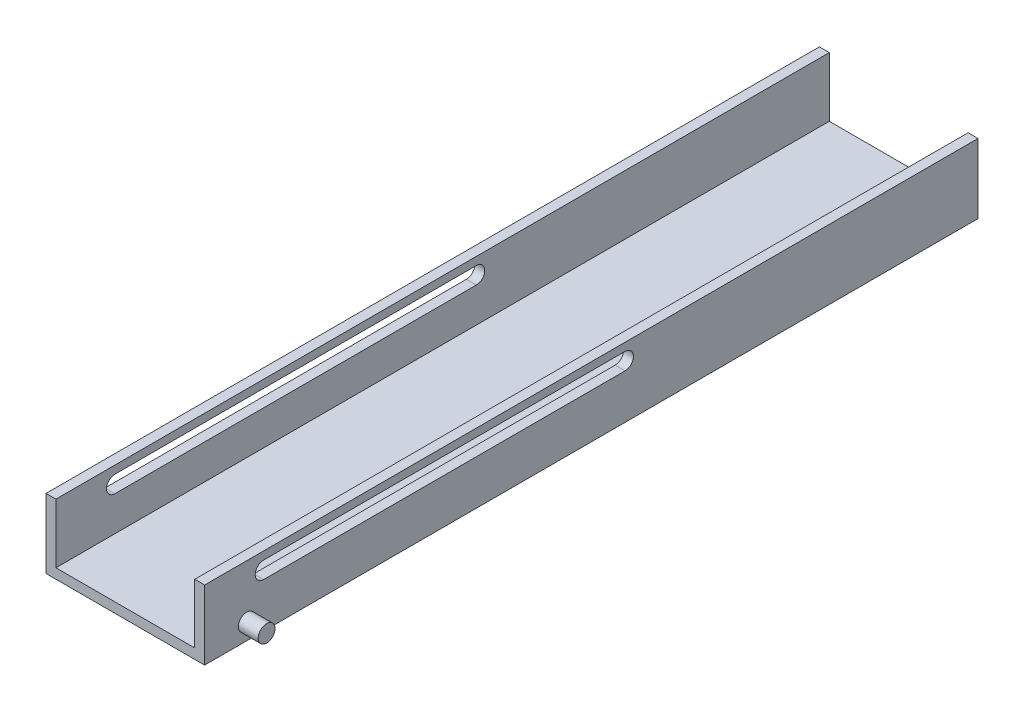
ISO-10303-21;
HEADER;
FILE_DESCRIPTION(('STEP AP214'),'2;1');
FILE_NAME('part.step','',(''),(''),'','','');
FILE_SCHEMA(('AUTOMOTIVE_DESIGN { 1 0 10303 214 1 1 1 1 }'));
ENDSEC;
DATA;
#1=APPLICATION_CONTEXT('core data for automotive mechanical design processes');
#2=APPLICATION_PROTOCOL_DEFINITION('international standard','automotive_design',2000,#1);
#3=PRODUCT_CONTEXT('',#1,'mechanical');
#4=PRODUCT('Part','Part','',(#3));
#5=PRODUCT_RELATED_PRODUCT_CATEGORY('part','',(#4));
#6=PRODUCT_DEFINITION_FORMATION('','',#4);
#7=PRODUCT_DEFINITION_CONTEXT('part definition',#1,'design');
#8=PRODUCT_DEFINITION('design','',#6,#7);
#9=PRODUCT_DEFINITION_SHAPE('','',#8);
#10=(LENGTH_UNIT() NAMED_UNIT(*) SI_UNIT(.MILLI.,.METRE.));
#11=(NAMED_UNIT(*) PLANE_ANGLE_UNIT() SI_UNIT($,.RADIAN.));
#12=(NAMED_UNIT(*) SI_UNIT($,.STERADIAN.) SOLID_ANGLE_UNIT());
#13=UNCERTAINTY_MEASURE_WITH_UNIT(LENGTH_MEASURE(1.E-05),#10,'distance_accuracy_value','');
#14=(GEOMETRIC_REPRESENTATION_CONTEXT(3) GLOBAL_UNCERTAINTY_ASSIGNED_CONTEXT((#13)) GLOBAL_UNIT_ASSIGNED_CONTEXT((#10,
#11,#12)) REPRESENTATION_CONTEXT('',''));
#15=CARTESIAN_POINT('',(0.,0.,0.));
#16=DIRECTION('',(0.,0.,1.));
#17=DIRECTION('',(1.,0.,0.));
#18=AXIS2_PLACEMENT_3D('',#15,#16,#17);
#19=CARTESIAN_POINT('',(20.,13.375,91.5));
#20=DIRECTION('',(-1.,0.,0.));
#21=DIRECTION('',(0.,0.,1.));
#22=AXIS2_PLACEMENT_3D('',#19,#20,#21);
#23=CYLINDRICAL_SURFACE('',#22,2.12499999999999);
#24=CARTESIAN_POINT('',(-17.5,13.375,91.5));
#25=DIRECTION('',(-1.,0.,0.));
#26=DIRECTION('',(0.,0.,1.));
#27=AXIS2_PLACEMENT_3D('',#24,#25,#26);
#28=CIRCLE('',#27,2.12499999999999);
#29=CARTESIAN_POINT('',(-17.5,11.25,91.5));
#30=VERTEX_POINT('',#29);
#31=CARTESIAN_POINT('',(-17.5,15.5,91.5));
#32=VERTEX_POINT('',#31);
#33=EDGE_CURVE('E11',#30,#32,#28,.T.);
#34=ORIENTED_EDGE('',*,*,#33,.F.);
#35=DIRECTION('',(-1.,0.,0.));
#36=VECTOR('',#35,1.);
#37=CARTESIAN_POINT('',(20.,11.25,91.5));
#38=LINE('',#37,#36);
#39=CARTESIAN_POINT('',(-20.,11.25,91.5));
#40=VERTEX_POINT('',#39);
#41=EDGE_CURVE('E221',#30,#40,#38,.T.);
#42=ORIENTED_EDGE('',*,*,#41,.T.);
#43=CARTESIAN_POINT('',(-20.,13.375,91.5));
#44=DIRECTION('',(1.,0.,0.));
#45=DIRECTION('',(0.,0.,1.));
#46=AXIS2_PLACEMENT_3D('',#43,#44,#45);
#47=CIRCLE('',#46,2.12499999999999);
#48=CARTESIAN_POINT('',(-20.,15.5,91.5));
#49=VERTEX_POINT('',#48);
#50=EDGE_CURVE('E211',#49,#40,#47,.T.);
#51=ORIENTED_EDGE('',*,*,#50,.F.);
#52=DIRECTION('',(-1.,0.,0.));
#53=VECTOR('',#52,1.);
#54=CARTESIAN_POINT('',(20.,15.5,91.5));
#55=LINE('',#54,#53);
#56=EDGE_CURVE('E214',#32,#49,#55,.T.);
#57=ORIENTED_EDGE('',*,*,#56,.F.);
#58=EDGE_LOOP('',(#34,#42,#51,#57));
#59=FACE_BOUND('',#58,.T.);
#60=ADVANCED_FACE('F39',(#59),#23,.F.);
#61=CARTESIAN_POINT('',(190.5,15.5,-90.75));
#62=DIRECTION('',(0.,1.,0.));
#63=DIRECTION('',(0.,0.,1.));
#64=AXIS2_PLACEMENT_3D('',#61,#62,#63);
#65=PLANE('',#64);
#66=ORIENTED_EDGE('',*,*,#56,.T.);
#67=DIRECTION('',(0.,0.,-1.));
#68=VECTOR('',#67,1.);
#69=CARTESIAN_POINT('',(-20.,15.5,-90.75));
#70=LINE('',#69,#68);
#71=CARTESIAN_POINT('',(-20.,15.5,0.374999999999997));
#72=VERTEX_POINT('',#71);
#73=EDGE_CURVE('E240',#49,#72,#70,.T.);
#74=ORIENTED_EDGE('',*,*,#73,.T.);
#75=DIRECTION('',(-1.,0.,0.));
#76=VECTOR('',#75,1.);
#77=CARTESIAN_POINT('',(30.,15.5,0.374999999999997));
#78=LINE('',#77,#76);
#79=CARTESIAN_POINT('',(-17.5,15.5,0.374999999999997));
#80=VERTEX_POINT('',#79);
#81=EDGE_CURVE('E228',#80,#72,#78,.T.);
#82=ORIENTED_EDGE('',*,*,#81,.F.);
#83=DIRECTION('',(0.,0.,-1.));
#84=VECTOR('',#83,1.);
#85=CARTESIAN_POINT('',(-17.5,15.5,-110.5));
#86=LINE('',#85,#84);
#87=EDGE_CURVE('E278',#32,#80,#86,.T.);
#88=ORIENTED_EDGE('',*,*,#87,.F.);
#89=EDGE_LOOP('',(#66,#74,#82,#88));
#90=FACE_BOUND('',#89,.T.);
#91=ADVANCED_FACE('F309',(#90),#65,.F.);
#92=CARTESIAN_POINT('',(20.,15.5,91.5));
#93=VERTEX_POINT('',#92);
#94=CARTESIAN_POINT('',(17.5,15.5,91.5));
#95=VERTEX_POINT('',#94);
#96=EDGE_CURVE('E222',#93,#95,#55,.T.);
#97=ORIENTED_EDGE('',*,*,#96,.T.);
#98=DIRECTION('',(0.,0.,1.));
#99=VECTOR('',#98,1.);
#100=CARTESIAN_POINT('',(17.5,15.5,-110.5));
#101=LINE('',#100,#99);
#102=CARTESIAN_POINT('',(17.5,15.5,0.374999999999997));
#103=VERTEX_POINT('',#102);
#104=EDGE_CURVE('E243',#103,#95,#101,.T.);
#105=ORIENTED_EDGE('',*,*,#104,.F.);
#106=CARTESIAN_POINT('',(20.,15.5,0.374999999999997));
#107=VERTEX_POINT('',#106);
#108=EDGE_CURVE('E231',#107,#103,#78,.T.);
#109=ORIENTED_EDGE('',*,*,#108,.F.);
#110=DIRECTION('',(0.,0.,-1.));
#111=VECTOR('',#110,1.);
#112=CARTESIAN_POINT('',(20.,15.5,100.));
#113=LINE('',#112,#111);
#114=EDGE_CURVE('E245',#93,#107,#113,.T.);
#115=ORIENTED_EDGE('',*,*,#114,.F.);
#116=EDGE_LOOP('',(#97,#105,#109,#115));
#117=FACE_BOUND('',#116,.T.);
#118=ADVANCED_FACE('F306',(#117),#65,.F.);
#119=CARTESIAN_POINT('',(190.5,11.25,-90.75));
#120=DIRECTION('',(0.,-1.,0.));
#121=DIRECTION('',(0.,0.,-1.));
#122=AXIS2_PLACEMENT_3D('',#119,#120,#121);
#123=PLANE('',#122);
#124=DIRECTION('',(0.,0.,1.));
#125=VECTOR('',#124,1.);
#126=CARTESIAN_POINT('',(-20.,11.25,-90.75));
#127=LINE('',#126,#125);
#128=CARTESIAN_POINT('',(-20.,11.25,0.374999999999997));
#129=VERTEX_POINT('',#128);
#130=EDGE_CURVE('E62',#129,#40,#127,.T.);
#131=ORIENTED_EDGE('',*,*,#130,.T.);
#132=ORIENTED_EDGE('',*,*,#41,.F.);
#133=DIRECTION('',(0.,0.,1.));
#134=VECTOR('',#133,1.);
#135=CARTESIAN_POINT('',(-17.5,11.25,-110.5));
#136=LINE('',#135,#134);
#137=CARTESIAN_POINT('',(-17.5,11.25,0.374999999999997));
#138=VERTEX_POINT('',#137);
#139=EDGE_CURVE('E280',#138,#30,#136,.T.);
#140=ORIENTED_EDGE('',*,*,#139,.F.);
#141=DIRECTION('',(-1.,0.,0.));
#142=VECTOR('',#141,1.);
#143=CARTESIAN_POINT('',(30.,11.25,0.374999999999997));
#144=LINE('',#143,#142);
#145=EDGE_CURVE('E227',#138,#129,#144,.T.);
#146=ORIENTED_EDGE('',*,*,#145,.T.);
#147=EDGE_LOOP('',(#131,#132,#140,#146));
#148=FACE_BOUND('',#147,.T.);
#149=ADVANCED_FACE('F308',(#148),#123,.F.);
#150=DIRECTION('',(0.,0.,-1.));
#151=VECTOR('',#150,1.);
#152=CARTESIAN_POINT('',(17.5,11.25,-110.5));
#153=LINE('',#152,#151);
#154=CARTESIAN_POINT('',(17.5,11.25,91.5));
#155=VERTEX_POINT('',#154);
#156=CARTESIAN_POINT('',(17.5,11.25,0.374999999999997));
#157=VERTEX_POINT('',#156);
#158=EDGE_CURVE('E247',#155,#157,#153,.T.);
#159=ORIENTED_EDGE('',*,*,#158,.F.);
#160=CARTESIAN_POINT('',(20.,11.25,91.5));
#161=VERTEX_POINT('',#160);
#162=EDGE_CURVE('E217',#161,#155,#38,.T.);
#163=ORIENTED_EDGE('',*,*,#162,.F.);
#164=DIRECTION('',(0.,0.,1.));
#165=VECTOR('',#164,1.);
#166=CARTESIAN_POINT('',(20.,11.25,100.));
#167=LINE('',#166,#165);
#168=CARTESIAN_POINT('',(20.,11.25,0.374999999999997));
#169=VERTEX_POINT('',#168);
#170=EDGE_CURVE('E249',#169,#161,#167,.T.);
#171=ORIENTED_EDGE('',*,*,#170,.F.);
#172=EDGE_CURVE('E232',#169,#157,#144,.T.);
#173=ORIENTED_EDGE('',*,*,#172,.T.);
#174=EDGE_LOOP('',(#159,#163,#171,#173));
#175=FACE_BOUND('',#174,.T.);
#176=ADVANCED_FACE('F295',(#175),#123,.F.);
#177=CARTESIAN_POINT('',(20.,20.,100.));
#178=DIRECTION('',(-1.,0.,0.));
#179=DIRECTION('',(0.,0.,1.));
#180=AXIS2_PLACEMENT_3D('',#177,#178,#179);
#181=PLANE('',#180);
#182=DIRECTION('',(0.,0.,-1.));
#183=VECTOR('',#182,1.);
#184=CARTESIAN_POINT('',(20.,0.,100.));
#185=LINE('',#184,#183);
#186=CARTESIAN_POINT('',(20.,0.,106.375));
#187=VERTEX_POINT('',#186);
#188=CARTESIAN_POINT('',(20.,0.,-88.625));
#189=VERTEX_POINT('',#188);
#190=EDGE_CURVE('E162',#187,#189,#185,.T.);
#191=ORIENTED_EDGE('',*,*,#190,.T.);
#192=DIRECTION('',(0.,1.,0.));
#193=VECTOR('',#192,1.);
#194=CARTESIAN_POINT('',(20.,20.,-88.625));
#195=LINE('',#194,#193);
#196=CARTESIAN_POINT('',(20.,17.5,-88.625));
#197=VERTEX_POINT('',#196);
#198=EDGE_CURVE('E208',#189,#197,#195,.T.);
#199=ORIENTED_EDGE('',*,*,#198,.T.);
#200=DIRECTION('',(0.,0.,-1.));
#201=VECTOR('',#200,1.);
#202=CARTESIAN_POINT('',(20.,17.5,100.));
#203=LINE('',#202,#201);
#204=CARTESIAN_POINT('',(20.,17.5,106.375));
#205=VERTEX_POINT('',#204);
#206=EDGE_CURVE('E256',#205,#197,#203,.T.);
#207=ORIENTED_EDGE('',*,*,#206,.F.);
#208=DIRECTION('',(0.,1.,0.));
#209=VECTOR('',#208,1.);
#210=CARTESIAN_POINT('',(20.,17.5,106.375));
#211=LINE('',#210,#209);
#212=EDGE_CURVE('E171',#187,#205,#211,.T.);
#213=ORIENTED_EDGE('',*,*,#212,.F.);
#214=EDGE_LOOP('',(#191,#199,#207,#213));
#215=FACE_BOUND('',#214,.T.);
#216=ORIENTED_EDGE('',*,*,#170,.T.);
#217=CARTESIAN_POINT('',(20.,13.375,91.5));
#218=DIRECTION('',(1.,0.,0.));
#219=DIRECTION('',(0.,0.,1.));
#220=AXIS2_PLACEMENT_3D('',#217,#218,#219);
#221=CIRCLE('',#220,2.12499999999999);
#222=EDGE_CURVE('E212',#93,#161,#221,.T.);
#223=ORIENTED_EDGE('',*,*,#222,.F.);
#224=ORIENTED_EDGE('',*,*,#114,.T.);
#225=CARTESIAN_POINT('',(20.,13.375,0.374999999999997));
#226=DIRECTION('',(-1.,0.,0.));
#227=DIRECTION('',(0.,0.,1.));
#228=AXIS2_PLACEMENT_3D('',#225,#226,#227);
#229=CIRCLE('',#228,2.12499999999999);
#230=EDGE_CURVE('E237',#107,#169,#229,.T.);
#231=ORIENTED_EDGE('',*,*,#230,.T.);
#232=EDGE_LOOP('',(#216,#223,#224,#231));
#233=FACE_BOUND('',#232,.T.);
#234=CARTESIAN_POINT('',(20.,4.125,95.75));
#235=DIRECTION('',(-1.,0.,0.));
#236=DIRECTION('',(0.,0.,1.));
#237=AXIS2_PLACEMENT_3D('',#234,#235,#236);
#238=CIRCLE('',#237,2.125);
#239=CARTESIAN_POINT('',(20.,4.125,97.875));
#240=VERTEX_POINT('',#239);
#241=EDGE_CURVE('E161',#240,#240,#238,.F.);
#242=ORIENTED_EDGE('',*,*,#241,.F.);
#243=EDGE_LOOP('',(#242));
#244=FACE_BOUND('',#243,.T.);
#245=ADVANCED_FACE('F41',(#215,#233,#244),#181,.F.);
#246=CARTESIAN_POINT('',(-20.,20.,100.));
#247=DIRECTION('',(1.,0.,0.));
#248=DIRECTION('',(0.,0.,-1.));
#249=AXIS2_PLACEMENT_3D('',#246,#247,#248);
#250=PLANE('',#249);
#251=ORIENTED_EDGE('',*,*,#73,.F.);
#252=ORIENTED_EDGE('',*,*,#50,.T.);
#253=ORIENTED_EDGE('',*,*,#130,.F.);
#254=CARTESIAN_POINT('',(-20.,13.375,0.374999999999997));
#255=DIRECTION('',(-1.,0.,0.));
#256=DIRECTION('',(0.,0.,1.));
#257=AXIS2_PLACEMENT_3D('',#254,#255,#256);
#258=CIRCLE('',#257,2.12499999999999);
#259=EDGE_CURVE('E220',#72,#129,#258,.T.);
#260=ORIENTED_EDGE('',*,*,#259,.F.);
#261=EDGE_LOOP('',(#251,#252,#253,#260));
#262=FACE_BOUND('',#261,.T.);
#263=DIRECTION('',(0.,0.,-1.));
#264=VECTOR('',#263,1.);
#265=CARTESIAN_POINT('',(-20.,17.5,0.));
#266=LINE('',#265,#264);
#267=CARTESIAN_POINT('',(-20.,17.5,106.375));
#268=VERTEX_POINT('',#267);
#269=CARTESIAN_POINT('',(-20.,17.5,-88.625));
#270=VERTEX_POINT('',#269);
#271=EDGE_CURVE('E252',#268,#270,#266,.T.);
#272=ORIENTED_EDGE('',*,*,#271,.T.);
#273=DIRECTION('',(0.,1.,0.));
#274=VECTOR('',#273,1.);
#275=CARTESIAN_POINT('',(-20.,17.5,-88.625));
#276=LINE('',#275,#274);
#277=CARTESIAN_POINT('',(-20.,0.,-88.625));
#278=VERTEX_POINT('',#277);
#279=EDGE_CURVE('E54',#278,#270,#276,.T.);
#280=ORIENTED_EDGE('',*,*,#279,.F.);
#281=DIRECTION('',(0.,0.,1.));
#282=VECTOR('',#281,1.);
#283=CARTESIAN_POINT('',(-20.,0.,100.));
#284=LINE('',#283,#282);
#285=CARTESIAN_POINT('',(-20.,0.,106.375));
#286=VERTEX_POINT('',#285);
#287=EDGE_CURVE('E152',#278,#286,#284,.T.);
#288=ORIENTED_EDGE('',*,*,#287,.T.);
#289=DIRECTION('',(0.,-1.,0.));
#290=VECTOR('',#289,1.);
#291=CARTESIAN_POINT('',(-20.,0.,106.375));
#292=LINE('',#291,#290);
#293=EDGE_CURVE('E158',#268,#286,#292,.T.);
#294=ORIENTED_EDGE('',*,*,#293,.F.);
#295=EDGE_LOOP('',(#272,#280,#288,#294));
#296=FACE_BOUND('',#295,.T.);
#297=CARTESIAN_POINT('',(-20.,4.125,95.75));
#298=DIRECTION('',(1.,0.,0.));
#299=DIRECTION('',(0.,0.,-1.));
#300=AXIS2_PLACEMENT_3D('',#297,#298,#299);
#301=CIRCLE('',#300,2.125);
#302=CARTESIAN_POINT('',(-20.,4.125,93.625));
#303=VERTEX_POINT('',#302);
#304=EDGE_CURVE('E272',#303,#303,#301,.F.);
#305=ORIENTED_EDGE('',*,*,#304,.F.);
#306=EDGE_LOOP('',(#305));
#307=FACE_BOUND('',#306,.T.);
#308=ADVANCED_FACE('F155',(#262,#296,#307),#250,.F.);
#309=CARTESIAN_POINT('',(17.5,37.5,-110.5));
#310=DIRECTION('',(1.,0.,0.));
#311=DIRECTION('',(0.,1.,0.));
#312=AXIS2_PLACEMENT_3D('',#309,#310,#311);
#313=PLANE('',#312);
#314=DIRECTION('',(0.,0.,1.));
#315=VECTOR('',#314,1.);
#316=CARTESIAN_POINT('',(17.5,17.5,-110.5));
#317=LINE('',#316,#315);
#318=CARTESIAN_POINT('',(17.5,17.5,-88.625));
#319=VERTEX_POINT('',#318);
#320=CARTESIAN_POINT('',(17.5,17.5,106.375));
#321=VERTEX_POINT('',#320);
#322=EDGE_CURVE('E254',#319,#321,#317,.T.);
#323=ORIENTED_EDGE('',*,*,#322,.F.);
#324=DIRECTION('',(0.,-1.,0.));
#325=VECTOR('',#324,1.);
#326=CARTESIAN_POINT('',(17.5,37.5,-88.625));
#327=LINE('',#326,#325);
#328=CARTESIAN_POINT('',(17.5,2.49999999999999,-88.625));
#329=VERTEX_POINT('',#328);
#330=EDGE_CURVE('E205',#319,#329,#327,.T.);
#331=ORIENTED_EDGE('',*,*,#330,.T.);
#332=DIRECTION('',(0.,0.,1.));
#333=VECTOR('',#332,1.);
#334=CARTESIAN_POINT('',(17.5,2.49999999999999,-110.5));
#335=LINE('',#334,#333);
#336=CARTESIAN_POINT('',(17.5,2.49999999999999,106.375));
#337=VERTEX_POINT('',#336);
#338=EDGE_CURVE('E260',#329,#337,#335,.T.);
#339=ORIENTED_EDGE('',*,*,#338,.T.);
#340=DIRECTION('',(0.,-1.,0.));
#341=VECTOR('',#340,1.);
#342=CARTESIAN_POINT('',(17.5,2.49999999999999,106.375));
#343=LINE('',#342,#341);
#344=EDGE_CURVE('E184',#321,#337,#343,.T.);
#345=ORIENTED_EDGE('',*,*,#344,.F.);
#346=EDGE_LOOP('',(#323,#331,#339,#345));
#347=FACE_BOUND('',#346,.T.);
#348=CARTESIAN_POINT('',(17.5,13.375,91.5));
#349=DIRECTION('',(1.,0.,0.));
#350=DIRECTION('',(0.,0.,-1.));
#351=AXIS2_PLACEMENT_3D('',#348,#349,#350);
#352=CIRCLE('',#351,2.12499999999999);
#353=EDGE_CURVE('E47',#95,#155,#352,.T.);
#354=ORIENTED_EDGE('',*,*,#353,.T.);
#355=ORIENTED_EDGE('',*,*,#158,.T.);
#356=CARTESIAN_POINT('',(17.5,13.375,0.374999999999997));
#357=DIRECTION('',(1.,0.,0.));
#358=DIRECTION('',(0.,1.,0.));
#359=AXIS2_PLACEMENT_3D('',#356,#357,#358);
#360=CIRCLE('',#359,2.12499999999999);
#361=EDGE_CURVE('E234',#157,#103,#360,.T.);
#362=ORIENTED_EDGE('',*,*,#361,.T.);
#363=ORIENTED_EDGE('',*,*,#104,.T.);
#364=EDGE_LOOP('',(#354,#355,#362,#363));
#365=FACE_BOUND('',#364,.T.);
#366=ADVANCED_FACE('F286',(#347,#365),#313,.F.);
#367=CARTESIAN_POINT('',(-17.5,37.5,-110.5));
#368=DIRECTION('',(-1.,0.,0.));
#369=DIRECTION('',(0.,-1.,0.));
#370=AXIS2_PLACEMENT_3D('',#367,#368,#369);
#371=PLANE('',#370);
#372=DIRECTION('',(0.,0.,1.));
#373=VECTOR('',#372,1.);
#374=CARTESIAN_POINT('',(-17.5,2.49999999999999,-110.5));
#375=LINE('',#374,#373);
#376=CARTESIAN_POINT('',(-17.5,2.49999999999999,-88.625));
#377=VERTEX_POINT('',#376);
#378=CARTESIAN_POINT('',(-17.5,2.49999999999999,106.375));
#379=VERTEX_POINT('',#378);
#380=EDGE_CURVE('E259',#377,#379,#375,.T.);
#381=ORIENTED_EDGE('',*,*,#380,.F.);
#382=DIRECTION('',(0.,1.,0.));
#383=VECTOR('',#382,1.);
#384=CARTESIAN_POINT('',(-17.5,37.5,-88.625));
#385=LINE('',#384,#383);
#386=CARTESIAN_POINT('',(-17.5,17.5,-88.625));
#387=VERTEX_POINT('',#386);
#388=EDGE_CURVE('E202',#377,#387,#385,.T.);
#389=ORIENTED_EDGE('',*,*,#388,.T.);
#390=DIRECTION('',(0.,0.,-1.));
#391=VECTOR('',#390,1.);
#392=CARTESIAN_POINT('',(-17.5,17.5,-110.5));
#393=LINE('',#392,#391);
#394=CARTESIAN_POINT('',(-17.5,17.5,106.375));
#395=VERTEX_POINT('',#394);
#396=EDGE_CURVE('E275',#395,#387,#393,.T.);
#397=ORIENTED_EDGE('',*,*,#396,.F.);
#398=DIRECTION('',(0.,1.,0.));
#399=VECTOR('',#398,1.);
#400=CARTESIAN_POINT('',(-17.5,17.5,106.375));
#401=LINE('',#400,#399);
#402=EDGE_CURVE('E190',#379,#395,#401,.T.);
#403=ORIENTED_EDGE('',*,*,#402,.F.);
#404=EDGE_LOOP('',(#381,#389,#397,#403));
#405=FACE_BOUND('',#404,.T.);
#406=ORIENTED_EDGE('',*,*,#139,.T.);
#407=ORIENTED_EDGE('',*,*,#33,.T.);
#408=ORIENTED_EDGE('',*,*,#87,.T.);
#409=CARTESIAN_POINT('',(-17.5,13.375,0.374999999999997));
#410=DIRECTION('',(-1.,0.,0.));
#411=DIRECTION('',(0.,-1.,0.));
#412=AXIS2_PLACEMENT_3D('',#409,#410,#411);
#413=CIRCLE('',#412,2.12499999999999);
#414=EDGE_CURVE('E282',#80,#138,#413,.T.);
#415=ORIENTED_EDGE('',*,*,#414,.T.);
#416=EDGE_LOOP('',(#406,#407,#408,#415));
#417=FACE_BOUND('',#416,.T.);
#418=ADVANCED_FACE('F355',(#405,#417),#371,.F.);
#419=CARTESIAN_POINT('',(0.,0.,0.));
#420=DIRECTION('',(0.,-1.,0.));
#421=DIRECTION('',(0.,0.,-1.));
#422=AXIS2_PLACEMENT_3D('',#419,#420,#421);
#423=PLANE('',#422);
#424=DIRECTION('',(-1.,0.,0.));
#425=VECTOR('',#424,1.);
#426=CARTESIAN_POINT('',(33.,0.,-88.625));
#427=LINE('',#426,#425);
#428=EDGE_CURVE('E194',#189,#278,#427,.T.);
#429=ORIENTED_EDGE('',*,*,#428,.F.);
#430=ORIENTED_EDGE('',*,*,#190,.F.);
#431=DIRECTION('',(1.,0.,0.));
#432=VECTOR('',#431,1.);
#433=CARTESIAN_POINT('',(20.,0.,106.375));
#434=LINE('',#433,#432);
#435=EDGE_CURVE('E165',#286,#187,#434,.T.);
#436=ORIENTED_EDGE('',*,*,#435,.F.);
#437=ORIENTED_EDGE('',*,*,#287,.F.);
#438=EDGE_LOOP('',(#429,#430,#436,#437));
#439=FACE_BOUND('',#438,.T.);
#440=ADVANCED_FACE('F166',(#439),#423,.T.);
#441=CARTESIAN_POINT('',(25.,4.125,95.75));
#442=DIRECTION('',(-1.,0.,0.));
#443=DIRECTION('',(0.,0.,1.));
#444=AXIS2_PLACEMENT_3D('',#441,#442,#443);
#445=CYLINDRICAL_SURFACE('',#444,2.125);
#446=CARTESIAN_POINT('',(25.,4.125,95.75));
#447=DIRECTION('',(1.,0.,0.));
#448=DIRECTION('',(0.,0.,-1.));
#449=AXIS2_PLACEMENT_3D('',#446,#447,#448);
#450=CIRCLE('',#449,2.125);
#451=CARTESIAN_POINT('',(25.,4.125,93.625));
#452=VERTEX_POINT('',#451);
#453=EDGE_CURVE('E266',#452,#452,#450,.T.);
#454=ORIENTED_EDGE('',*,*,#453,.F.);
#455=EDGE_LOOP('',(#454));
#456=FACE_BOUND('',#455,.T.);
#457=ORIENTED_EDGE('',*,*,#241,.T.);
#458=EDGE_LOOP('',(#457));
#459=FACE_BOUND('',#458,.T.);
#460=ADVANCED_FACE('F364',(#456,#459),#445,.T.);
#461=CARTESIAN_POINT('',(25.,0.,0.));
#462=DIRECTION('',(1.,0.,0.));
#463=DIRECTION('',(0.,0.,-1.));
#464=AXIS2_PLACEMENT_3D('',#461,#462,#463);
#465=PLANE('',#464);
#466=ORIENTED_EDGE('',*,*,#453,.T.);
#467=EDGE_LOOP('',(#466));
#468=FACE_BOUND('',#467,.T.);
#469=ADVANCED_FACE('F378',(#468),#465,.T.);
#470=CARTESIAN_POINT('',(-25.,4.125,95.75));
#471=DIRECTION('',(1.,0.,0.));
#472=DIRECTION('',(0.,0.,-1.));
#473=AXIS2_PLACEMENT_3D('',#470,#471,#472);
#474=CYLINDRICAL_SURFACE('',#473,2.125);
#475=CARTESIAN_POINT('',(-25.,4.125,95.75));
#476=DIRECTION('',(-1.,0.,0.));
#477=DIRECTION('',(0.,0.,1.));
#478=AXIS2_PLACEMENT_3D('',#475,#476,#477);
#479=CIRCLE('',#478,2.125);
#480=CARTESIAN_POINT('',(-25.,4.125,97.875));
#481=VERTEX_POINT('',#480);
#482=EDGE_CURVE('E262',#481,#481,#479,.T.);
#483=ORIENTED_EDGE('',*,*,#482,.F.);
#484=EDGE_LOOP('',(#483));
#485=FACE_BOUND('',#484,.T.);
#486=ORIENTED_EDGE('',*,*,#304,.T.);
#487=EDGE_LOOP('',(#486));
#488=FACE_BOUND('',#487,.T.);
#489=ADVANCED_FACE('F374',(#485,#488),#474,.T.);
#490=CARTESIAN_POINT('',(-25.,4.125,95.75));
#491=DIRECTION('',(-1.,0.,0.));
#492=DIRECTION('',(0.,0.,1.));
#493=AXIS2_PLACEMENT_3D('',#490,#491,#492);
#494=PLANE('',#493);
#495=ORIENTED_EDGE('',*,*,#482,.T.);
#496=EDGE_LOOP('',(#495));
#497=FACE_BOUND('',#496,.T.);
#498=ADVANCED_FACE('F372',(#497),#494,.T.);
#499=CARTESIAN_POINT('',(-17.5,2.49999999999999,-110.5));
#500=DIRECTION('',(0.,-1.,0.));
#501=DIRECTION('',(0.,0.,-1.));
#502=AXIS2_PLACEMENT_3D('',#499,#500,#501);
#503=PLANE('',#502);
#504=ORIENTED_EDGE('',*,*,#338,.F.);
#505=DIRECTION('',(-1.,0.,0.));
#506=VECTOR('',#505,1.);
#507=CARTESIAN_POINT('',(-17.5,2.49999999999999,-88.625));
#508=LINE('',#507,#506);
#509=EDGE_CURVE('E199',#329,#377,#508,.T.);
#510=ORIENTED_EDGE('',*,*,#509,.T.);
#511=ORIENTED_EDGE('',*,*,#380,.T.);
#512=DIRECTION('',(-1.,0.,0.));
#513=VECTOR('',#512,1.);
#514=CARTESIAN_POINT('',(-17.5,2.49999999999999,106.375));
#515=LINE('',#514,#513);
#516=EDGE_CURVE('E187',#337,#379,#515,.T.);
#517=ORIENTED_EDGE('',*,*,#516,.F.);
#518=EDGE_LOOP('',(#504,#510,#511,#517));
#519=FACE_BOUND('',#518,.T.);
#520=ADVANCED_FACE('F370',(#519),#503,.F.);
#521=CARTESIAN_POINT('',(190.5,17.5,0.));
#522=DIRECTION('',(0.,1.,0.));
#523=DIRECTION('',(0.,0.,1.));
#524=AXIS2_PLACEMENT_3D('',#521,#522,#523);
#525=PLANE('',#524);
#526=DIRECTION('',(-1.,0.,0.));
#527=VECTOR('',#526,1.);
#528=CARTESIAN_POINT('',(33.,17.5,-88.625));
#529=LINE('',#528,#527);
#530=EDGE_CURVE('E197',#197,#319,#529,.T.);
#531=ORIENTED_EDGE('',*,*,#530,.T.);
#532=ORIENTED_EDGE('',*,*,#322,.T.);
#533=DIRECTION('',(-1.,0.,0.));
#534=VECTOR('',#533,1.);
#535=CARTESIAN_POINT('',(17.5,17.5,106.375));
#536=LINE('',#535,#534);
#537=EDGE_CURVE('E181',#205,#321,#536,.T.);
#538=ORIENTED_EDGE('',*,*,#537,.F.);
#539=ORIENTED_EDGE('',*,*,#206,.T.);
#540=EDGE_LOOP('',(#531,#532,#538,#539));
#541=FACE_BOUND('',#540,.T.);
#542=ADVANCED_FACE('F344',(#541),#525,.T.);
#543=EDGE_CURVE('E195',#387,#270,#529,.T.);
#544=ORIENTED_EDGE('',*,*,#543,.T.);
#545=ORIENTED_EDGE('',*,*,#271,.F.);
#546=DIRECTION('',(-1.,0.,0.));
#547=VECTOR('',#546,1.);
#548=CARTESIAN_POINT('',(-20.,17.5,106.375));
#549=LINE('',#548,#547);
#550=EDGE_CURVE('E177',#395,#268,#549,.T.);
#551=ORIENTED_EDGE('',*,*,#550,.F.);
#552=ORIENTED_EDGE('',*,*,#396,.T.);
#553=EDGE_LOOP('',(#544,#545,#551,#552));
#554=FACE_BOUND('',#553,.T.);
#555=ADVANCED_FACE('F338',(#554),#525,.T.);
#556=CARTESIAN_POINT('',(30.,13.375,0.374999999999997));
#557=DIRECTION('',(-1.,0.,0.));
#558=DIRECTION('',(0.,0.,1.));
#559=AXIS2_PLACEMENT_3D('',#556,#557,#558);
#560=CYLINDRICAL_SURFACE('',#559,2.12499999999999);
#561=ORIENTED_EDGE('',*,*,#81,.T.);
#562=ORIENTED_EDGE('',*,*,#259,.T.);
#563=ORIENTED_EDGE('',*,*,#145,.F.);
#564=ORIENTED_EDGE('',*,*,#414,.F.);
#565=EDGE_LOOP('',(#561,#562,#563,#564));
#566=FACE_BOUND('',#565,.T.);
#567=ADVANCED_FACE('F334',(#566),#560,.F.);
#568=ORIENTED_EDGE('',*,*,#108,.T.);
#569=ORIENTED_EDGE('',*,*,#361,.F.);
#570=ORIENTED_EDGE('',*,*,#172,.F.);
#571=ORIENTED_EDGE('',*,*,#230,.F.);
#572=EDGE_LOOP('',(#568,#569,#570,#571));
#573=FACE_BOUND('',#572,.T.);
#574=ADVANCED_FACE('F300',(#573),#560,.F.);
#575=ORIENTED_EDGE('',*,*,#353,.F.);
#576=ORIENTED_EDGE('',*,*,#96,.F.);
#577=ORIENTED_EDGE('',*,*,#222,.T.);
#578=ORIENTED_EDGE('',*,*,#162,.T.);
#579=EDGE_LOOP('',(#575,#576,#577,#578));
#580=FACE_BOUND('',#579,.T.);
#581=ADVANCED_FACE('F292',(#580),#23,.F.);
#582=CARTESIAN_POINT('',(33.,17.5,-88.625));
#583=DIRECTION('',(0.,0.,1.));
#584=DIRECTION('',(1.,0.,0.));
#585=AXIS2_PLACEMENT_3D('',#582,#583,#584);
#586=PLANE('',#585);
#587=ORIENTED_EDGE('',*,*,#428,.T.);
#588=ORIENTED_EDGE('',*,*,#279,.T.);
#589=ORIENTED_EDGE('',*,*,#543,.F.);
#590=ORIENTED_EDGE('',*,*,#388,.F.);
#591=ORIENTED_EDGE('',*,*,#509,.F.);
#592=ORIENTED_EDGE('',*,*,#330,.F.);
#593=ORIENTED_EDGE('',*,*,#530,.F.);
#594=ORIENTED_EDGE('',*,*,#198,.F.);
#595=EDGE_LOOP('',(#587,#588,#589,#590,#591,#592,#593,#594));
#596=FACE_BOUND('',#595,.T.);
#597=ADVANCED_FACE('F328',(#596),#586,.F.);
#598=CARTESIAN_POINT('',(0.,0.,106.375));
#599=DIRECTION('',(0.,0.,-1.));
#600=DIRECTION('',(-1.,0.,0.));
#601=AXIS2_PLACEMENT_3D('',#598,#599,#600);
#602=PLANE('',#601);
#603=ORIENTED_EDGE('',*,*,#293,.T.);
#604=ORIENTED_EDGE('',*,*,#435,.T.);
#605=ORIENTED_EDGE('',*,*,#212,.T.);
#606=ORIENTED_EDGE('',*,*,#537,.T.);
#607=ORIENTED_EDGE('',*,*,#344,.T.);
#608=ORIENTED_EDGE('',*,*,#516,.T.);
#609=ORIENTED_EDGE('',*,*,#402,.T.);
#610=ORIENTED_EDGE('',*,*,#550,.T.);
#611=EDGE_LOOP('',(#603,#604,#605,#606,#607,#608,#609,#610));
#612=FACE_BOUND('',#611,.T.);
#613=ADVANCED_FACE('F174',(#612),#602,.F.);
#614=CLOSED_SHELL('',(#60,#91,#118,#149,#176,#245,#308,#366,#418,#440,#460,#469,#489,#498,#520,
#542,#555,#567,#574,#581,#597,#613));
#615=MANIFOLD_SOLID_BREP('B2',#614);
#616=ADVANCED_BREP_SHAPE_REPRESENTATION('',(#18,#615),#14);
#617=SHAPE_DEFINITION_REPRESENTATION(#9,#616);
ENDSEC;
END-ISO-10303-21;
